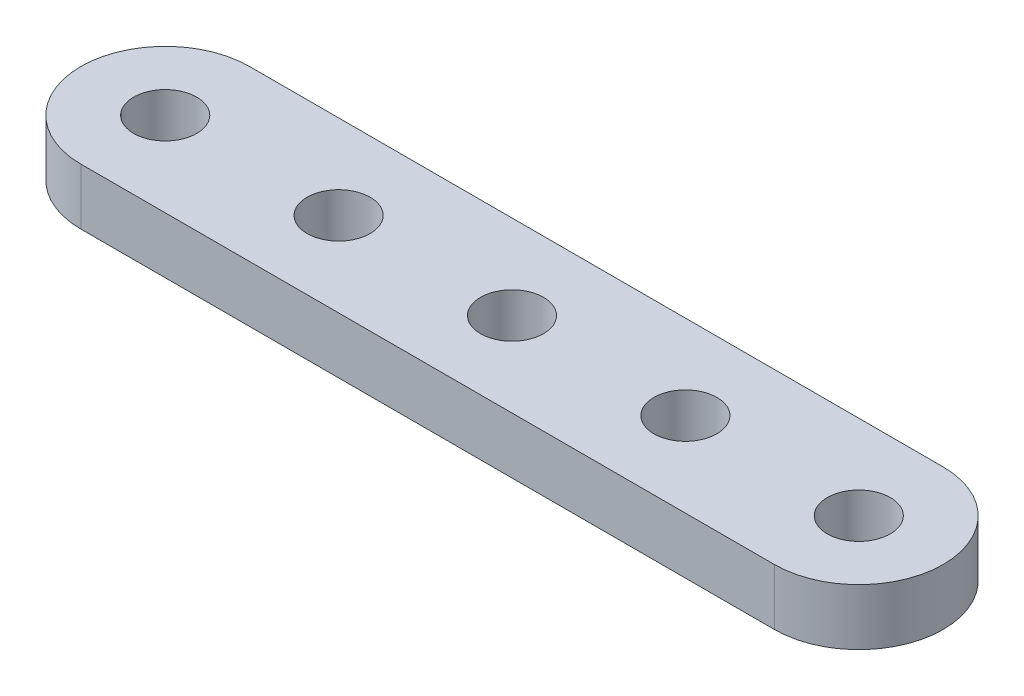
ISO-10303-21;
HEADER;
FILE_DESCRIPTION(('STEP AP214'),'2;1');
FILE_NAME('part.step','',(''),(''),'','','');
FILE_SCHEMA(('AUTOMOTIVE_DESIGN { 1 0 10303 214 1 1 1 1 }'));
ENDSEC;
DATA;
#1=APPLICATION_CONTEXT('core data for automotive mechanical design processes');
#2=APPLICATION_PROTOCOL_DEFINITION('international standard','automotive_design',2000,#1);
#3=PRODUCT_CONTEXT('',#1,'mechanical');
#4=PRODUCT('Part','Part','',(#3));
#5=PRODUCT_RELATED_PRODUCT_CATEGORY('part','',(#4));
#6=PRODUCT_DEFINITION_FORMATION('','',#4);
#7=PRODUCT_DEFINITION_CONTEXT('part definition',#1,'design');
#8=PRODUCT_DEFINITION('design','',#6,#7);
#9=PRODUCT_DEFINITION_SHAPE('','',#8);
#10=(LENGTH_UNIT() NAMED_UNIT(*) SI_UNIT(.MILLI.,.METRE.));
#11=(NAMED_UNIT(*) PLANE_ANGLE_UNIT() SI_UNIT($,.RADIAN.));
#12=(NAMED_UNIT(*) SI_UNIT($,.STERADIAN.) SOLID_ANGLE_UNIT());
#13=UNCERTAINTY_MEASURE_WITH_UNIT(LENGTH_MEASURE(1.E-05),#10,'distance_accuracy_value','');
#14=(GEOMETRIC_REPRESENTATION_CONTEXT(3) GLOBAL_UNCERTAINTY_ASSIGNED_CONTEXT((#13)) GLOBAL_UNIT_ASSIGNED_CONTEXT((#10,
#11,#12)) REPRESENTATION_CONTEXT('',''));
#15=CARTESIAN_POINT('',(0.,0.,0.));
#16=DIRECTION('',(0.,0.,1.));
#17=DIRECTION('',(1.,0.,0.));
#18=AXIS2_PLACEMENT_3D('',#15,#16,#17);
#19=CARTESIAN_POINT('',(-19.558,3.175,0.));
#20=DIRECTION('',(0.,1.,0.));
#21=DIRECTION('',(0.,0.,1.));
#22=AXIS2_PLACEMENT_3D('',#19,#20,#21);
#23=PLANE('',#22);
#24=CARTESIAN_POINT('',(19.558,3.175,0.));
#25=DIRECTION('',(0.,-1.,0.));
#26=DIRECTION('',(0.,0.,-1.));
#27=AXIS2_PLACEMENT_3D('',#24,#25,#26);
#28=CIRCLE('',#27,4.7625);
#29=CARTESIAN_POINT('',(19.558,3.175,-4.7625));
#30=VERTEX_POINT('',#29);
#31=CARTESIAN_POINT('',(19.558,3.175,4.7625));
#32=VERTEX_POINT('',#31);
#33=EDGE_CURVE('E55',#30,#32,#28,.T.);
#34=ORIENTED_EDGE('',*,*,#33,.F.);
#35=DIRECTION('',(1.,0.,0.));
#36=VECTOR('',#35,1.);
#37=CARTESIAN_POINT('',(-19.558,3.175,-4.7625));
#38=LINE('',#37,#36);
#39=CARTESIAN_POINT('',(-19.558,3.175,-4.7625));
#40=VERTEX_POINT('',#39);
#41=EDGE_CURVE('E79',#30,#40,#38,.F.);
#42=ORIENTED_EDGE('',*,*,#41,.T.);
#43=CARTESIAN_POINT('',(-19.558,3.175,0.));
#44=DIRECTION('',(0.,-1.,0.));
#45=DIRECTION('',(0.,0.,-1.));
#46=AXIS2_PLACEMENT_3D('',#43,#44,#45);
#47=CIRCLE('',#46,4.7625);
#48=CARTESIAN_POINT('',(-19.558,3.175,4.7625));
#49=VERTEX_POINT('',#48);
#50=EDGE_CURVE('E69',#49,#40,#47,.T.);
#51=ORIENTED_EDGE('',*,*,#50,.F.);
#52=DIRECTION('',(-1.,0.,0.));
#53=VECTOR('',#52,1.);
#54=CARTESIAN_POINT('',(-19.558,3.175,4.7625));
#55=LINE('',#54,#53);
#56=EDGE_CURVE('E65',#49,#32,#55,.F.);
#57=ORIENTED_EDGE('',*,*,#56,.T.);
#58=EDGE_LOOP('',(#34,#42,#51,#57));
#59=FACE_BOUND('',#58,.T.);
#60=CARTESIAN_POINT('',(19.558,3.175,0.));
#61=DIRECTION('',(0.,1.,0.));
#62=DIRECTION('',(0.,0.,1.));
#63=AXIS2_PLACEMENT_3D('',#60,#61,#62);
#64=CIRCLE('',#63,1.778);
#65=CARTESIAN_POINT('',(19.558,3.175,1.778));
#66=VERTEX_POINT('',#65);
#67=EDGE_CURVE('E73',#66,#66,#64,.F.);
#68=ORIENTED_EDGE('',*,*,#67,.T.);
#69=EDGE_LOOP('',(#68));
#70=FACE_BOUND('',#69,.T.);
#71=CARTESIAN_POINT('',(9.77899999999999,3.175,0.));
#72=DIRECTION('',(0.,1.,0.));
#73=DIRECTION('',(0.,0.,1.));
#74=AXIS2_PLACEMENT_3D('',#71,#72,#73);
#75=CIRCLE('',#74,1.778);
#76=CARTESIAN_POINT('',(9.77899999999999,3.175,1.778));
#77=VERTEX_POINT('',#76);
#78=EDGE_CURVE('E105',#77,#77,#75,.F.);
#79=ORIENTED_EDGE('',*,*,#78,.T.);
#80=EDGE_LOOP('',(#79));
#81=FACE_BOUND('',#80,.T.);
#82=CARTESIAN_POINT('',(0.,3.175,0.));
#83=DIRECTION('',(0.,1.,0.));
#84=DIRECTION('',(0.,0.,1.));
#85=AXIS2_PLACEMENT_3D('',#82,#83,#84);
#86=CIRCLE('',#85,1.778);
#87=CARTESIAN_POINT('',(0.,3.175,1.778));
#88=VERTEX_POINT('',#87);
#89=EDGE_CURVE('E108',#88,#88,#86,.F.);
#90=ORIENTED_EDGE('',*,*,#89,.T.);
#91=EDGE_LOOP('',(#90));
#92=FACE_BOUND('',#91,.T.);
#93=CARTESIAN_POINT('',(-9.77900000000001,3.175,0.));
#94=DIRECTION('',(0.,1.,0.));
#95=DIRECTION('',(0.,0.,1.));
#96=AXIS2_PLACEMENT_3D('',#93,#94,#95);
#97=CIRCLE('',#96,1.778);
#98=CARTESIAN_POINT('',(-9.77900000000001,3.175,1.778));
#99=VERTEX_POINT('',#98);
#100=EDGE_CURVE('E110',#99,#99,#97,.F.);
#101=ORIENTED_EDGE('',*,*,#100,.T.);
#102=EDGE_LOOP('',(#101));
#103=FACE_BOUND('',#102,.T.);
#104=CARTESIAN_POINT('',(-19.558,3.175,0.));
#105=DIRECTION('',(0.,1.,0.));
#106=DIRECTION('',(0.,0.,1.));
#107=AXIS2_PLACEMENT_3D('',#104,#105,#106);
#108=CIRCLE('',#107,1.778);
#109=CARTESIAN_POINT('',(-19.558,3.175,1.778));
#110=VERTEX_POINT('',#109);
#111=EDGE_CURVE('E20',#110,#110,#108,.F.);
#112=ORIENTED_EDGE('',*,*,#111,.T.);
#113=EDGE_LOOP('',(#112));
#114=FACE_BOUND('',#113,.T.);
#115=ADVANCED_FACE('F17',(#59,#70,#81,#92,#103,#114),#23,.T.);
#116=CARTESIAN_POINT('',(-19.558,3.175,0.));
#117=DIRECTION('',(0.,1.,0.));
#118=DIRECTION('',(0.,0.,1.));
#119=AXIS2_PLACEMENT_3D('',#116,#117,#118);
#120=CYLINDRICAL_SURFACE('',#119,1.778);
#121=CARTESIAN_POINT('',(-19.558,0.,0.));
#122=DIRECTION('',(0.,1.,0.));
#123=DIRECTION('',(0.,0.,1.));
#124=AXIS2_PLACEMENT_3D('',#121,#122,#123);
#125=CIRCLE('',#124,1.778);
#126=CARTESIAN_POINT('',(-19.558,0.,1.778));
#127=VERTEX_POINT('',#126);
#128=EDGE_CURVE('E99',#127,#127,#125,.F.);
#129=ORIENTED_EDGE('',*,*,#128,.T.);
#130=EDGE_LOOP('',(#129));
#131=FACE_BOUND('',#130,.T.);
#132=ORIENTED_EDGE('',*,*,#111,.F.);
#133=EDGE_LOOP('',(#132));
#134=FACE_BOUND('',#133,.T.);
#135=ADVANCED_FACE('F118',(#131,#134),#120,.F.);
#136=CARTESIAN_POINT('',(-9.77900000000001,3.175,0.));
#137=DIRECTION('',(0.,1.,0.));
#138=DIRECTION('',(0.,0.,1.));
#139=AXIS2_PLACEMENT_3D('',#136,#137,#138);
#140=CYLINDRICAL_SURFACE('',#139,1.778);
#141=CARTESIAN_POINT('',(-9.77900000000001,0.,0.));
#142=DIRECTION('',(0.,1.,0.));
#143=DIRECTION('',(0.,0.,1.));
#144=AXIS2_PLACEMENT_3D('',#141,#142,#143);
#145=CIRCLE('',#144,1.778);
#146=CARTESIAN_POINT('',(-9.77900000000001,0.,1.778));
#147=VERTEX_POINT('',#146);
#148=EDGE_CURVE('E96',#147,#147,#145,.F.);
#149=ORIENTED_EDGE('',*,*,#148,.T.);
#150=EDGE_LOOP('',(#149));
#151=FACE_BOUND('',#150,.T.);
#152=ORIENTED_EDGE('',*,*,#100,.F.);
#153=EDGE_LOOP('',(#152));
#154=FACE_BOUND('',#153,.T.);
#155=ADVANCED_FACE('F120',(#151,#154),#140,.F.);
#156=CARTESIAN_POINT('',(0.,3.175,0.));
#157=DIRECTION('',(0.,1.,0.));
#158=DIRECTION('',(0.,0.,1.));
#159=AXIS2_PLACEMENT_3D('',#156,#157,#158);
#160=CYLINDRICAL_SURFACE('',#159,1.778);
#161=CARTESIAN_POINT('',(0.,0.,0.));
#162=DIRECTION('',(0.,1.,0.));
#163=DIRECTION('',(0.,0.,1.));
#164=AXIS2_PLACEMENT_3D('',#161,#162,#163);
#165=CIRCLE('',#164,1.778);
#166=CARTESIAN_POINT('',(0.,0.,1.778));
#167=VERTEX_POINT('',#166);
#168=EDGE_CURVE('E93',#167,#167,#165,.F.);
#169=ORIENTED_EDGE('',*,*,#168,.T.);
#170=EDGE_LOOP('',(#169));
#171=FACE_BOUND('',#170,.T.);
#172=ORIENTED_EDGE('',*,*,#89,.F.);
#173=EDGE_LOOP('',(#172));
#174=FACE_BOUND('',#173,.T.);
#175=ADVANCED_FACE('F127',(#171,#174),#160,.F.);
#176=CARTESIAN_POINT('',(9.77899999999999,3.175,0.));
#177=DIRECTION('',(0.,1.,0.));
#178=DIRECTION('',(0.,0.,1.));
#179=AXIS2_PLACEMENT_3D('',#176,#177,#178);
#180=CYLINDRICAL_SURFACE('',#179,1.778);
#181=CARTESIAN_POINT('',(9.77899999999999,0.,0.));
#182=DIRECTION('',(0.,1.,0.));
#183=DIRECTION('',(0.,0.,1.));
#184=AXIS2_PLACEMENT_3D('',#181,#182,#183);
#185=CIRCLE('',#184,1.778);
#186=CARTESIAN_POINT('',(9.77899999999999,0.,1.778));
#187=VERTEX_POINT('',#186);
#188=EDGE_CURVE('E90',#187,#187,#185,.F.);
#189=ORIENTED_EDGE('',*,*,#188,.T.);
#190=EDGE_LOOP('',(#189));
#191=FACE_BOUND('',#190,.T.);
#192=ORIENTED_EDGE('',*,*,#78,.F.);
#193=EDGE_LOOP('',(#192));
#194=FACE_BOUND('',#193,.T.);
#195=ADVANCED_FACE('F153',(#191,#194),#180,.F.);
#196=CARTESIAN_POINT('',(19.558,3.175,0.));
#197=DIRECTION('',(0.,1.,0.));
#198=DIRECTION('',(0.,0.,1.));
#199=AXIS2_PLACEMENT_3D('',#196,#197,#198);
#200=CYLINDRICAL_SURFACE('',#199,1.778);
#201=CARTESIAN_POINT('',(19.558,0.,0.));
#202=DIRECTION('',(0.,1.,0.));
#203=DIRECTION('',(0.,0.,1.));
#204=AXIS2_PLACEMENT_3D('',#201,#202,#203);
#205=CIRCLE('',#204,1.778);
#206=CARTESIAN_POINT('',(19.558,0.,1.778));
#207=VERTEX_POINT('',#206);
#208=EDGE_CURVE('E87',#207,#207,#205,.F.);
#209=ORIENTED_EDGE('',*,*,#208,.T.);
#210=EDGE_LOOP('',(#209));
#211=FACE_BOUND('',#210,.T.);
#212=ORIENTED_EDGE('',*,*,#67,.F.);
#213=EDGE_LOOP('',(#212));
#214=FACE_BOUND('',#213,.T.);
#215=ADVANCED_FACE('F150',(#211,#214),#200,.F.);
#216=CARTESIAN_POINT('',(-19.558,3.175,4.7625));
#217=DIRECTION('',(0.,0.,-1.));
#218=DIRECTION('',(-1.,0.,0.));
#219=AXIS2_PLACEMENT_3D('',#216,#217,#218);
#220=PLANE('',#219);
#221=DIRECTION('',(0.,-1.,0.));
#222=VECTOR('',#221,1.);
#223=CARTESIAN_POINT('',(19.558,3.175,4.7625));
#224=LINE('',#223,#222);
#225=CARTESIAN_POINT('',(19.558,0.,4.7625));
#226=VERTEX_POINT('',#225);
#227=EDGE_CURVE('E62',#32,#226,#224,.T.);
#228=ORIENTED_EDGE('',*,*,#227,.F.);
#229=ORIENTED_EDGE('',*,*,#56,.F.);
#230=DIRECTION('',(0.,-1.,0.));
#231=VECTOR('',#230,1.);
#232=CARTESIAN_POINT('',(-19.558,3.175,4.7625));
#233=LINE('',#232,#231);
#234=CARTESIAN_POINT('',(-19.558,0.,4.7625));
#235=VERTEX_POINT('',#234);
#236=EDGE_CURVE('E83',#235,#49,#233,.F.);
#237=ORIENTED_EDGE('',*,*,#236,.F.);
#238=DIRECTION('',(1.,0.,0.));
#239=VECTOR('',#238,1.);
#240=CARTESIAN_POINT('',(-19.558,0.,4.7625));
#241=LINE('',#240,#239);
#242=EDGE_CURVE('E77',#235,#226,#241,.T.);
#243=ORIENTED_EDGE('',*,*,#242,.T.);
#244=EDGE_LOOP('',(#228,#229,#237,#243));
#245=FACE_BOUND('',#244,.T.);
#246=ADVANCED_FACE('F76',(#245),#220,.F.);
#247=CARTESIAN_POINT('',(19.558,3.175,0.));
#248=DIRECTION('',(0.,-1.,0.));
#249=DIRECTION('',(0.,0.,-1.));
#250=AXIS2_PLACEMENT_3D('',#247,#248,#249);
#251=CYLINDRICAL_SURFACE('',#250,4.7625);
#252=ORIENTED_EDGE('',*,*,#33,.T.);
#253=ORIENTED_EDGE('',*,*,#227,.T.);
#254=CARTESIAN_POINT('',(19.558,0.,0.));
#255=DIRECTION('',(0.,-1.,0.));
#256=DIRECTION('',(0.,0.,-1.));
#257=AXIS2_PLACEMENT_3D('',#254,#255,#256);
#258=CIRCLE('',#257,4.7625);
#259=CARTESIAN_POINT('',(19.558,0.,-4.7625));
#260=VERTEX_POINT('',#259);
#261=EDGE_CURVE('E85',#226,#260,#258,.F.);
#262=ORIENTED_EDGE('',*,*,#261,.T.);
#263=DIRECTION('',(0.,1.,0.));
#264=VECTOR('',#263,1.);
#265=CARTESIAN_POINT('',(19.558,3.175,-4.7625));
#266=LINE('',#265,#264);
#267=EDGE_CURVE('E64',#260,#30,#266,.T.);
#268=ORIENTED_EDGE('',*,*,#267,.T.);
#269=EDGE_LOOP('',(#252,#253,#262,#268));
#270=FACE_BOUND('',#269,.T.);
#271=ADVANCED_FACE('F59',(#270),#251,.T.);
#272=CARTESIAN_POINT('',(-19.558,3.175,-4.7625));
#273=DIRECTION('',(0.,0.,1.));
#274=DIRECTION('',(1.,0.,0.));
#275=AXIS2_PLACEMENT_3D('',#272,#273,#274);
#276=PLANE('',#275);
#277=DIRECTION('',(0.,-1.,0.));
#278=VECTOR('',#277,1.);
#279=CARTESIAN_POINT('',(-19.558,3.175,-4.7625));
#280=LINE('',#279,#278);
#281=CARTESIAN_POINT('',(-19.558,0.,-4.7625));
#282=VERTEX_POINT('',#281);
#283=EDGE_CURVE('E34',#40,#282,#280,.T.);
#284=ORIENTED_EDGE('',*,*,#283,.F.);
#285=ORIENTED_EDGE('',*,*,#41,.F.);
#286=ORIENTED_EDGE('',*,*,#267,.F.);
#287=DIRECTION('',(1.,0.,0.));
#288=VECTOR('',#287,1.);
#289=CARTESIAN_POINT('',(-19.558,0.,-4.7625));
#290=LINE('',#289,#288);
#291=EDGE_CURVE('E26',#260,#282,#290,.F.);
#292=ORIENTED_EDGE('',*,*,#291,.T.);
#293=EDGE_LOOP('',(#284,#285,#286,#292));
#294=FACE_BOUND('',#293,.T.);
#295=ADVANCED_FACE('F138',(#294),#276,.F.);
#296=CARTESIAN_POINT('',(-19.558,3.175,0.));
#297=DIRECTION('',(0.,-1.,0.));
#298=DIRECTION('',(0.,0.,-1.));
#299=AXIS2_PLACEMENT_3D('',#296,#297,#298);
#300=CYLINDRICAL_SURFACE('',#299,4.7625);
#301=ORIENTED_EDGE('',*,*,#50,.T.);
#302=ORIENTED_EDGE('',*,*,#283,.T.);
#303=CARTESIAN_POINT('',(-19.558,0.,0.));
#304=DIRECTION('',(0.,-1.,0.));
#305=DIRECTION('',(0.,0.,-1.));
#306=AXIS2_PLACEMENT_3D('',#303,#304,#305);
#307=CIRCLE('',#306,4.7625);
#308=EDGE_CURVE('E10',#282,#235,#307,.F.);
#309=ORIENTED_EDGE('',*,*,#308,.T.);
#310=ORIENTED_EDGE('',*,*,#236,.T.);
#311=EDGE_LOOP('',(#301,#302,#309,#310));
#312=FACE_BOUND('',#311,.T.);
#313=ADVANCED_FACE('F132',(#312),#300,.T.);
#314=CARTESIAN_POINT('',(-19.558,0.,0.));
#315=DIRECTION('',(0.,1.,0.));
#316=DIRECTION('',(0.,0.,1.));
#317=AXIS2_PLACEMENT_3D('',#314,#315,#316);
#318=PLANE('',#317);
#319=ORIENTED_EDGE('',*,*,#291,.F.);
#320=ORIENTED_EDGE('',*,*,#261,.F.);
#321=ORIENTED_EDGE('',*,*,#242,.F.);
#322=ORIENTED_EDGE('',*,*,#308,.F.);
#323=EDGE_LOOP('',(#319,#320,#321,#322));
#324=FACE_BOUND('',#323,.T.);
#325=ORIENTED_EDGE('',*,*,#208,.F.);
#326=EDGE_LOOP('',(#325));
#327=FACE_BOUND('',#326,.T.);
#328=ORIENTED_EDGE('',*,*,#188,.F.);
#329=EDGE_LOOP('',(#328));
#330=FACE_BOUND('',#329,.T.);
#331=ORIENTED_EDGE('',*,*,#168,.F.);
#332=EDGE_LOOP('',(#331));
#333=FACE_BOUND('',#332,.T.);
#334=ORIENTED_EDGE('',*,*,#148,.F.);
#335=EDGE_LOOP('',(#334));
#336=FACE_BOUND('',#335,.T.);
#337=ORIENTED_EDGE('',*,*,#128,.F.);
#338=EDGE_LOOP('',(#337));
#339=FACE_BOUND('',#338,.T.);
#340=ADVANCED_FACE('F130',(#324,#327,#330,#333,#336,#339),#318,.F.);
#341=CLOSED_SHELL('',(#115,#135,#155,#175,#195,#215,#246,#271,#295,#313,#340));
#342=MANIFOLD_SOLID_BREP('B1',#341);
#343=ADVANCED_BREP_SHAPE_REPRESENTATION('',(#18,#342),#14);
#344=SHAPE_DEFINITION_REPRESENTATION(#9,#343);
ENDSEC;
END-ISO-10303-21;
